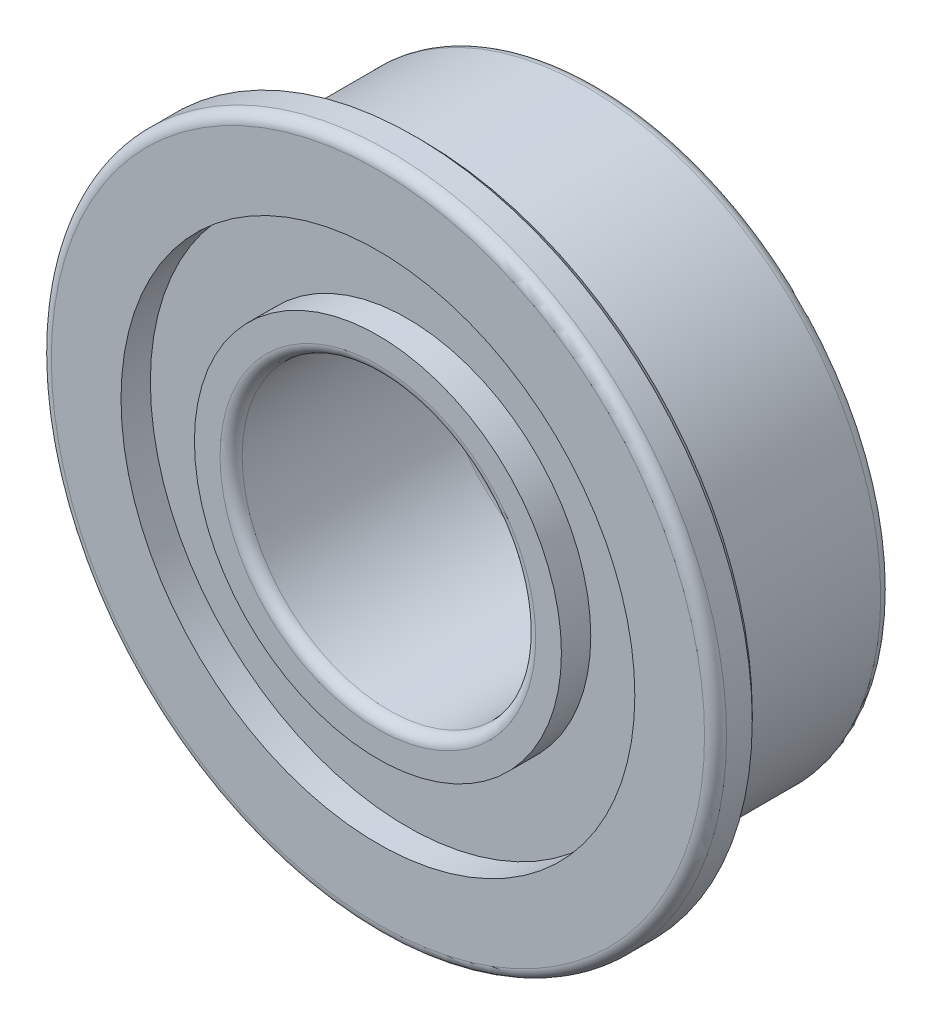
ISO-10303-21;
HEADER;
FILE_DESCRIPTION(('STEP AP214'),'2;1');
FILE_NAME('part.step','',(''),(''),'','','');
FILE_SCHEMA(('AUTOMOTIVE_DESIGN { 1 0 10303 214 1 1 1 1 }'));
ENDSEC;
DATA;
#1=APPLICATION_CONTEXT('core data for automotive mechanical design processes');
#2=APPLICATION_PROTOCOL_DEFINITION('international standard','automotive_design',2000,#1);
#3=PRODUCT_CONTEXT('',#1,'mechanical');
#4=PRODUCT('Part','Part','',(#3));
#5=PRODUCT_RELATED_PRODUCT_CATEGORY('part','',(#4));
#6=PRODUCT_DEFINITION_FORMATION('','',#4);
#7=PRODUCT_DEFINITION_CONTEXT('part definition',#1,'design');
#8=PRODUCT_DEFINITION('design','',#6,#7);
#9=PRODUCT_DEFINITION_SHAPE('','',#8);
#10=(LENGTH_UNIT() NAMED_UNIT(*) SI_UNIT(.MILLI.,.METRE.));
#11=(NAMED_UNIT(*) PLANE_ANGLE_UNIT() SI_UNIT($,.RADIAN.));
#12=(NAMED_UNIT(*) SI_UNIT($,.STERADIAN.) SOLID_ANGLE_UNIT());
#13=UNCERTAINTY_MEASURE_WITH_UNIT(LENGTH_MEASURE(1.E-05),#10,'distance_accuracy_value','');
#14=(GEOMETRIC_REPRESENTATION_CONTEXT(3) GLOBAL_UNCERTAINTY_ASSIGNED_CONTEXT((#13)) GLOBAL_UNIT_ASSIGNED_CONTEXT((#10,
#11,#12)) REPRESENTATION_CONTEXT('',''));
#15=CARTESIAN_POINT('',(0.,0.,0.));
#16=DIRECTION('',(0.,0.,1.));
#17=DIRECTION('',(1.,0.,0.));
#18=AXIS2_PLACEMENT_3D('',#15,#16,#17);
#19=CARTESIAN_POINT('',(0.,0.,2.85));
#20=DIRECTION('',(0.,0.,1.));
#21=DIRECTION('',(1.,0.,0.));
#22=AXIS2_PLACEMENT_3D('',#19,#20,#21);
#23=TOROIDAL_SURFACE('',#22,2.15,0.15);
#24=CARTESIAN_POINT('',(-2.15,0.,3.));
#25=CARTESIAN_POINT('',(-2.14979765177593,0.410125898039826,3.));
#26=CARTESIAN_POINT('',(-1.99904484728423,0.791403625558022,3.));
#27=CARTESIAN_POINT('',(-1.83568089713617,1.20457693852465,3.));
#28=CARTESIAN_POINT('',(-1.52027957955108,1.52027957955107,3.));
#29=CARTESIAN_POINT('',(-1.20631967116049,1.83453943431082,3.));
#30=CARTESIAN_POINT('',(-0.791403625558034,1.99904484728422,3.));
#31=CARTESIAN_POINT('',(-0.411157912228449,2.14980420876378,3.));
#32=CARTESIAN_POINT('',(0.,2.15,3.));
#33=CARTESIAN_POINT('',(0.409121407156996,2.15019482146321,3.));
#34=CARTESIAN_POINT('',(0.791403625558023,1.99904484728423,3.));
#35=CARTESIAN_POINT('',(1.2045769485649,1.83568088710541,3.));
#36=CARTESIAN_POINT('',(1.52027957955108,1.52027957955108,3.));
#37=CARTESIAN_POINT('',(1.83453929710262,1.20631980823783,3.));
#38=CARTESIAN_POINT('',(1.99904484728423,0.791403625558026,3.));
#39=CARTESIAN_POINT('',(2.14979713370125,0.411175948489697,3.));
#40=CARTESIAN_POINT('',(2.15,0.,3.));
#41=B_SPLINE_CURVE_WITH_KNOTS('',2,(#24,#25,#26,#27,#28,#29,#30,#31,#32,#33,#34,#35,#36,#37,#38,
#39,#40),.UNSPECIFIED.,.F.,.F.,(3,2,2,2,2,2,2,2,3),(0.,0.125,0.25,0.375,0.5,0.625,0.75,0.875,
1.),.UNSPECIFIED.);
#42=CARTESIAN_POINT('',(-2.15,0.,3.));
#43=VERTEX_POINT('',#42);
#44=CARTESIAN_POINT('',(2.15,0.,3.));
#45=VERTEX_POINT('',#44);
#46=EDGE_CURVE('E32',#43,#45,#41,.T.);
#47=ORIENTED_EDGE('',*,*,#46,.F.);
#48=CARTESIAN_POINT('',(2.15,0.,3.));
#49=CARTESIAN_POINT('',(2.14979765177593,-0.410125898040651,3.));
#50=CARTESIAN_POINT('',(1.99904484728422,-0.791403625558032,3.));
#51=CARTESIAN_POINT('',(1.83568089713584,-1.20457693852461,3.));
#52=CARTESIAN_POINT('',(1.52027957955108,-1.52027957955108,3.));
#53=CARTESIAN_POINT('',(1.20631967116154,-1.83453943431015,3.));
#54=CARTESIAN_POINT('',(0.791403625558024,-1.99904484728423,3.));
#55=CARTESIAN_POINT('',(0.411157912228607,-2.14980420876395,3.));
#56=CARTESIAN_POINT('',(0.,-2.15,3.));
#57=CARTESIAN_POINT('',(-0.409121407158147,-2.15019482146304,3.));
#58=CARTESIAN_POINT('',(-0.791403625558026,-1.99904484728423,3.));
#59=CARTESIAN_POINT('',(-1.20457694856478,-1.83568088710515,3.));
#60=CARTESIAN_POINT('',(-1.52027957955108,-1.52027957955108,3.));
#61=CARTESIAN_POINT('',(-1.83453929710133,-1.2063198082395,3.));
#62=CARTESIAN_POINT('',(-1.99904484728423,-0.791403625558031,3.));
#63=CARTESIAN_POINT('',(-2.14979713370124,-0.41117594849115,3.));
#64=CARTESIAN_POINT('',(-2.15,0.,3.));
#65=B_SPLINE_CURVE_WITH_KNOTS('',2,(#48,#49,#50,#51,#52,#53,#54,#55,#56,#57,#58,#59,#60,#61,#62,
#63,#64),.UNSPECIFIED.,.F.,.F.,(3,2,2,2,2,2,2,2,3),(0.,0.125,0.25,0.375,0.5,0.625,0.75,0.875,
1.),.UNSPECIFIED.);
#66=EDGE_CURVE('E34',#45,#43,#65,.T.);
#67=ORIENTED_EDGE('',*,*,#66,.F.);
#68=EDGE_LOOP('',(#47,#67));
#69=FACE_BOUND('',#68,.T.);
#70=CARTESIAN_POINT('',(0.,0.,2.85));
#71=DIRECTION('',(0.,0.,-1.));
#72=DIRECTION('',(-1.,0.,0.));
#73=AXIS2_PLACEMENT_3D('',#70,#71,#72);
#74=CIRCLE('',#73,2.);
#75=CARTESIAN_POINT('',(-2.,0.,2.85));
#76=VERTEX_POINT('',#75);
#77=EDGE_CURVE('E40',#76,#76,#74,.T.);
#78=ORIENTED_EDGE('',*,*,#77,.T.);
#79=EDGE_LOOP('',(#78));
#80=FACE_BOUND('',#79,.T.);
#81=ADVANCED_FACE('F16',(#69,#80),#23,.T.);
#82=CARTESIAN_POINT('',(0.,0.,3.));
#83=DIRECTION('',(0.,0.,1.));
#84=DIRECTION('',(1.,0.,0.));
#85=AXIS2_PLACEMENT_3D('',#82,#83,#84);
#86=PLANE('',#85);
#87=ORIENTED_EDGE('',*,*,#66,.T.);
#88=ORIENTED_EDGE('',*,*,#46,.T.);
#89=EDGE_LOOP('',(#87,#88));
#90=FACE_BOUND('',#89,.T.);
#91=CARTESIAN_POINT('',(0.,0.,3.));
#92=DIRECTION('',(0.,0.,1.));
#93=DIRECTION('',(1.,0.,0.));
#94=AXIS2_PLACEMENT_3D('',#91,#92,#93);
#95=CIRCLE('',#94,2.5);
#96=CARTESIAN_POINT('',(2.5,0.,3.));
#97=VERTEX_POINT('',#96);
#98=EDGE_CURVE('E20',#97,#97,#95,.F.);
#99=ORIENTED_EDGE('',*,*,#98,.F.);
#100=EDGE_LOOP('',(#99));
#101=FACE_BOUND('',#100,.T.);
#102=ADVANCED_FACE('F38',(#90,#101),#86,.T.);
#103=CARTESIAN_POINT('',(0.,0.,3.));
#104=DIRECTION('',(0.,0.,-1.));
#105=DIRECTION('',(-1.,0.,0.));
#106=AXIS2_PLACEMENT_3D('',#103,#104,#105);
#107=CYLINDRICAL_SURFACE('',#106,2.);
#108=CARTESIAN_POINT('',(0.,0.,0.15));
#109=DIRECTION('',(0.,0.,1.));
#110=DIRECTION('',(1.,0.,0.));
#111=AXIS2_PLACEMENT_3D('',#108,#109,#110);
#112=CIRCLE('',#111,2.);
#113=CARTESIAN_POINT('',(2.,0.,0.15));
#114=VERTEX_POINT('',#113);
#115=EDGE_CURVE('E145',#114,#114,#112,.T.);
#116=ORIENTED_EDGE('',*,*,#115,.F.);
#117=EDGE_LOOP('',(#116));
#118=FACE_BOUND('',#117,.T.);
#119=ORIENTED_EDGE('',*,*,#77,.F.);
#120=EDGE_LOOP('',(#119));
#121=FACE_BOUND('',#120,.T.);
#122=ADVANCED_FACE('F58',(#118,#121),#107,.F.);
#123=CARTESIAN_POINT('',(0.,0.,2.6));
#124=DIRECTION('',(0.,0.,1.));
#125=DIRECTION('',(1.,0.,0.));
#126=AXIS2_PLACEMENT_3D('',#123,#124,#125);
#127=CYLINDRICAL_SURFACE('',#126,2.5);
#128=ORIENTED_EDGE('',*,*,#98,.T.);
#129=EDGE_LOOP('',(#128));
#130=FACE_BOUND('',#129,.T.);
#131=CARTESIAN_POINT('',(0.,0.,2.6));
#132=DIRECTION('',(0.,0.,1.));
#133=DIRECTION('',(1.,0.,0.));
#134=AXIS2_PLACEMENT_3D('',#131,#132,#133);
#135=CIRCLE('',#134,2.5);
#136=CARTESIAN_POINT('',(2.5,0.,2.6));
#137=VERTEX_POINT('',#136);
#138=EDGE_CURVE('E143',#137,#137,#135,.F.);
#139=ORIENTED_EDGE('',*,*,#138,.F.);
#140=EDGE_LOOP('',(#139));
#141=FACE_BOUND('',#140,.T.);
#142=ADVANCED_FACE('F67',(#130,#141),#127,.T.);
#143=CARTESIAN_POINT('',(0.,0.,0.15));
#144=DIRECTION('',(0.,0.,1.));
#145=DIRECTION('',(1.,0.,0.));
#146=AXIS2_PLACEMENT_3D('',#143,#144,#145);
#147=TOROIDAL_SURFACE('',#146,2.15,0.15);
#148=ORIENTED_EDGE('',*,*,#115,.T.);
#149=EDGE_LOOP('',(#148));
#150=FACE_BOUND('',#149,.T.);
#151=CARTESIAN_POINT('',(0.,0.,0.));
#152=DIRECTION('',(0.,0.,1.));
#153=DIRECTION('',(1.,0.,0.));
#154=AXIS2_PLACEMENT_3D('',#151,#152,#153);
#155=CIRCLE('',#154,2.15);
#156=CARTESIAN_POINT('',(2.15,0.,0.));
#157=VERTEX_POINT('',#156);
#158=EDGE_CURVE('E144',#157,#157,#155,.F.);
#159=ORIENTED_EDGE('',*,*,#158,.T.);
#160=EDGE_LOOP('',(#159));
#161=FACE_BOUND('',#160,.T.);
#162=ADVANCED_FACE('F63',(#150,#161),#147,.T.);
#163=CARTESIAN_POINT('',(0.,0.,2.6));
#164=DIRECTION('',(0.,0.,1.));
#165=DIRECTION('',(1.,0.,0.));
#166=AXIS2_PLACEMENT_3D('',#163,#164,#165);
#167=PLANE('',#166);
#168=ORIENTED_EDGE('',*,*,#138,.T.);
#169=EDGE_LOOP('',(#168));
#170=FACE_BOUND('',#169,.T.);
#171=CARTESIAN_POINT('',(0.,0.,2.6));
#172=DIRECTION('',(0.,0.,1.));
#173=DIRECTION('',(1.,0.,0.));
#174=AXIS2_PLACEMENT_3D('',#171,#172,#173);
#175=CIRCLE('',#174,3.5);
#176=CARTESIAN_POINT('',(3.5,0.,2.6));
#177=VERTEX_POINT('',#176);
#178=EDGE_CURVE('E147',#177,#177,#175,.T.);
#179=ORIENTED_EDGE('',*,*,#178,.T.);
#180=EDGE_LOOP('',(#179));
#181=FACE_BOUND('',#180,.T.);
#182=ADVANCED_FACE('F66',(#170,#181),#167,.T.);
#183=CARTESIAN_POINT('',(0.,0.,0.));
#184=DIRECTION('',(0.,0.,1.));
#185=DIRECTION('',(1.,0.,0.));
#186=AXIS2_PLACEMENT_3D('',#183,#184,#185);
#187=PLANE('',#186);
#188=CARTESIAN_POINT('',(0.,0.,0.));
#189=DIRECTION('',(0.,0.,1.));
#190=DIRECTION('',(1.,0.,0.));
#191=AXIS2_PLACEMENT_3D('',#188,#189,#190);
#192=CIRCLE('',#191,2.35);
#193=CARTESIAN_POINT('',(2.35,0.,0.));
#194=VERTEX_POINT('',#193);
#195=EDGE_CURVE('E153',#194,#194,#192,.T.);
#196=ORIENTED_EDGE('',*,*,#195,.F.);
#197=EDGE_LOOP('',(#196));
#198=FACE_BOUND('',#197,.T.);
#199=ORIENTED_EDGE('',*,*,#158,.F.);
#200=EDGE_LOOP('',(#199));
#201=FACE_BOUND('',#200,.T.);
#202=ADVANCED_FACE('F125',(#198,#201),#187,.F.);
#203=CARTESIAN_POINT('',(0.,0.,2.6));
#204=DIRECTION('',(0.,0.,1.));
#205=DIRECTION('',(1.,0.,0.));
#206=AXIS2_PLACEMENT_3D('',#203,#204,#205);
#207=CYLINDRICAL_SURFACE('',#206,3.5);
#208=ORIENTED_EDGE('',*,*,#178,.F.);
#209=EDGE_LOOP('',(#208));
#210=FACE_BOUND('',#209,.T.);
#211=CARTESIAN_POINT('',(0.,0.,3.));
#212=DIRECTION('',(0.,0.,1.));
#213=DIRECTION('',(1.,0.,0.));
#214=AXIS2_PLACEMENT_3D('',#211,#212,#213);
#215=CIRCLE('',#214,3.5);
#216=CARTESIAN_POINT('',(3.5,0.,3.));
#217=VERTEX_POINT('',#216);
#218=EDGE_CURVE('E156',#217,#217,#215,.F.);
#219=ORIENTED_EDGE('',*,*,#218,.F.);
#220=EDGE_LOOP('',(#219));
#221=FACE_BOUND('',#220,.T.);
#222=ADVANCED_FACE('F72',(#210,#221),#207,.F.);
#223=CARTESIAN_POINT('',(0.,0.,0.15));
#224=DIRECTION('',(0.,0.,1.));
#225=DIRECTION('',(1.,0.,0.));
#226=AXIS2_PLACEMENT_3D('',#223,#224,#225);
#227=TOROIDAL_SURFACE('',#226,2.35,0.15);
#228=CARTESIAN_POINT('',(0.,0.,0.15));
#229=DIRECTION('',(0.,0.,-1.));
#230=DIRECTION('',(-1.,0.,0.));
#231=AXIS2_PLACEMENT_3D('',#228,#229,#230);
#232=CIRCLE('',#231,2.5);
#233=CARTESIAN_POINT('',(-2.5,0.,0.15));
#234=VERTEX_POINT('',#233);
#235=EDGE_CURVE('E159',#234,#234,#232,.F.);
#236=ORIENTED_EDGE('',*,*,#235,.F.);
#237=EDGE_LOOP('',(#236));
#238=FACE_BOUND('',#237,.T.);
#239=ORIENTED_EDGE('',*,*,#195,.T.);
#240=EDGE_LOOP('',(#239));
#241=FACE_BOUND('',#240,.T.);
#242=ADVANCED_FACE('F69',(#238,#241),#227,.T.);
#243=CARTESIAN_POINT('',(0.,0.,3.));
#244=DIRECTION('',(0.,0.,1.));
#245=DIRECTION('',(1.,0.,0.));
#246=AXIS2_PLACEMENT_3D('',#243,#244,#245);
#247=PLANE('',#246);
#248=CARTESIAN_POINT('',(0.,0.,3.));
#249=DIRECTION('',(0.,0.,1.));
#250=DIRECTION('',(0.,-1.,0.));
#251=AXIS2_PLACEMENT_3D('',#248,#249,#250);
#252=CIRCLE('',#251,4.45);
#253=CARTESIAN_POINT('',(0.,-4.45,3.));
#254=VERTEX_POINT('',#253);
#255=EDGE_CURVE('E160',#254,#254,#252,.F.);
#256=ORIENTED_EDGE('',*,*,#255,.F.);
#257=EDGE_LOOP('',(#256));
#258=FACE_BOUND('',#257,.T.);
#259=ORIENTED_EDGE('',*,*,#218,.T.);
#260=EDGE_LOOP('',(#259));
#261=FACE_BOUND('',#260,.T.);
#262=ADVANCED_FACE('F71',(#258,#261),#247,.T.);
#263=CARTESIAN_POINT('',(0.,0.,0.2));
#264=DIRECTION('',(0.,0.,-1.));
#265=DIRECTION('',(-1.,0.,0.));
#266=AXIS2_PLACEMENT_3D('',#263,#264,#265);
#267=CYLINDRICAL_SURFACE('',#266,2.5);
#268=ORIENTED_EDGE('',*,*,#235,.T.);
#269=EDGE_LOOP('',(#268));
#270=FACE_BOUND('',#269,.T.);
#271=CARTESIAN_POINT('',(0.,0.,0.2));
#272=DIRECTION('',(0.,0.,-1.));
#273=DIRECTION('',(-1.,0.,0.));
#274=AXIS2_PLACEMENT_3D('',#271,#272,#273);
#275=CIRCLE('',#274,2.5);
#276=CARTESIAN_POINT('',(-2.5,0.,0.2));
#277=VERTEX_POINT('',#276);
#278=EDGE_CURVE('E162',#277,#277,#275,.F.);
#279=ORIENTED_EDGE('',*,*,#278,.F.);
#280=EDGE_LOOP('',(#279));
#281=FACE_BOUND('',#280,.T.);
#282=ADVANCED_FACE('F77',(#270,#281),#267,.T.);
#283=CARTESIAN_POINT('',(0.,0.,2.85));
#284=DIRECTION('',(0.,0.,1.));
#285=DIRECTION('',(0.,-1.,0.));
#286=AXIS2_PLACEMENT_3D('',#283,#284,#285);
#287=TOROIDAL_SURFACE('',#286,4.45,0.149999999999999);
#288=ORIENTED_EDGE('',*,*,#255,.T.);
#289=EDGE_LOOP('',(#288));
#290=FACE_BOUND('',#289,.T.);
#291=CARTESIAN_POINT('',(0.,0.,2.85));
#292=DIRECTION('',(0.,0.,1.));
#293=DIRECTION('',(1.,0.,0.));
#294=AXIS2_PLACEMENT_3D('',#291,#292,#293);
#295=CIRCLE('',#294,4.6);
#296=CARTESIAN_POINT('',(4.6,0.,2.85));
#297=VERTEX_POINT('',#296);
#298=EDGE_CURVE('E165',#297,#297,#295,.F.);
#299=ORIENTED_EDGE('',*,*,#298,.F.);
#300=EDGE_LOOP('',(#299));
#301=FACE_BOUND('',#300,.T.);
#302=ADVANCED_FACE('F74',(#290,#301),#287,.T.);
#303=CARTESIAN_POINT('',(0.,0.,0.2));
#304=DIRECTION('',(0.,0.,-1.));
#305=DIRECTION('',(-1.,0.,0.));
#306=AXIS2_PLACEMENT_3D('',#303,#304,#305);
#307=PLANE('',#306);
#308=ORIENTED_EDGE('',*,*,#278,.T.);
#309=EDGE_LOOP('',(#308));
#310=FACE_BOUND('',#309,.T.);
#311=CARTESIAN_POINT('',(0.,0.,0.2));
#312=DIRECTION('',(0.,0.,-1.));
#313=DIRECTION('',(-1.,0.,0.));
#314=AXIS2_PLACEMENT_3D('',#311,#312,#313);
#315=CIRCLE('',#314,3.5);
#316=CARTESIAN_POINT('',(-3.5,0.,0.2));
#317=VERTEX_POINT('',#316);
#318=EDGE_CURVE('E166',#317,#317,#315,.T.);
#319=ORIENTED_EDGE('',*,*,#318,.T.);
#320=EDGE_LOOP('',(#319));
#321=FACE_BOUND('',#320,.T.);
#322=ADVANCED_FACE('F76',(#310,#321),#307,.T.);
#323=CARTESIAN_POINT('',(0.,0.,2.4));
#324=DIRECTION('',(0.,0.,1.));
#325=DIRECTION('',(1.,0.,0.));
#326=AXIS2_PLACEMENT_3D('',#323,#324,#325);
#327=CYLINDRICAL_SURFACE('',#326,4.6);
#328=ORIENTED_EDGE('',*,*,#298,.T.);
#329=EDGE_LOOP('',(#328));
#330=FACE_BOUND('',#329,.T.);
#331=CARTESIAN_POINT('',(0.,0.,2.49999999994088));
#332=DIRECTION('',(0.,0.,1.));
#333=DIRECTION('',(1.,0.,0.));
#334=AXIS2_PLACEMENT_3D('',#331,#332,#333);
#335=CIRCLE('',#334,4.59999999992533);
#336=CARTESIAN_POINT('',(4.59999999992533,0.,2.49999999994088));
#337=VERTEX_POINT('',#336);
#338=EDGE_CURVE('E169',#337,#337,#335,.F.);
#339=ORIENTED_EDGE('',*,*,#338,.F.);
#340=EDGE_LOOP('',(#339));
#341=FACE_BOUND('',#340,.T.);
#342=ADVANCED_FACE('F84',(#330,#341),#327,.T.);
#343=CARTESIAN_POINT('',(0.,0.,0.2));
#344=DIRECTION('',(0.,0.,-1.));
#345=DIRECTION('',(-1.,0.,0.));
#346=AXIS2_PLACEMENT_3D('',#343,#344,#345);
#347=CYLINDRICAL_SURFACE('',#346,3.5);
#348=ORIENTED_EDGE('',*,*,#318,.F.);
#349=EDGE_LOOP('',(#348));
#350=FACE_BOUND('',#349,.T.);
#351=CARTESIAN_POINT('',(0.,0.,0.));
#352=DIRECTION('',(0.,0.,-1.));
#353=DIRECTION('',(-1.,0.,0.));
#354=AXIS2_PLACEMENT_3D('',#351,#352,#353);
#355=CIRCLE('',#354,3.5);
#356=CARTESIAN_POINT('',(-3.5,0.,0.));
#357=VERTEX_POINT('',#356);
#358=EDGE_CURVE('E170',#357,#357,#355,.T.);
#359=ORIENTED_EDGE('',*,*,#358,.T.);
#360=EDGE_LOOP('',(#359));
#361=FACE_BOUND('',#360,.T.);
#362=ADVANCED_FACE('F112',(#350,#361),#347,.F.);
#363=CARTESIAN_POINT('',(0.,0.,2.49999999994088));
#364=DIRECTION('',(0.,0.,1.));
#365=DIRECTION('',(1.,0.,0.));
#366=AXIS2_PLACEMENT_3D('',#363,#364,#365);
#367=CONICAL_SURFACE('',#366,4.59999999992533,0.785398163397448);
#368=ORIENTED_EDGE('',*,*,#338,.T.);
#369=EDGE_LOOP('',(#368));
#370=FACE_BOUND('',#369,.T.);
#371=CARTESIAN_POINT('',(0.,0.,2.39999999990914));
#372=DIRECTION('',(0.,0.,1.));
#373=DIRECTION('',(1.,0.,0.));
#374=AXIS2_PLACEMENT_3D('',#371,#372,#373);
#375=CIRCLE('',#374,4.49999999989359);
#376=CARTESIAN_POINT('',(4.49999999989359,0.,2.39999999990914));
#377=VERTEX_POINT('',#376);
#378=EDGE_CURVE('E173',#377,#377,#375,.T.);
#379=ORIENTED_EDGE('',*,*,#378,.T.);
#380=EDGE_LOOP('',(#379));
#381=FACE_BOUND('',#380,.T.);
#382=ADVANCED_FACE('F108',(#370,#381),#367,.T.);
#383=CARTESIAN_POINT('',(0.,0.,0.));
#384=DIRECTION('',(0.,0.,1.));
#385=DIRECTION('',(1.,0.,0.));
#386=AXIS2_PLACEMENT_3D('',#383,#384,#385);
#387=PLANE('',#386);
#388=CARTESIAN_POINT('',(0.,0.,0.));
#389=DIRECTION('',(0.,0.,1.));
#390=DIRECTION('',(1.,0.,0.));
#391=AXIS2_PLACEMENT_3D('',#388,#389,#390);
#392=CIRCLE('',#391,3.85);
#393=CARTESIAN_POINT('',(3.85,0.,0.));
#394=VERTEX_POINT('',#393);
#395=EDGE_CURVE('E176',#394,#394,#392,.T.);
#396=ORIENTED_EDGE('',*,*,#395,.F.);
#397=EDGE_LOOP('',(#396));
#398=FACE_BOUND('',#397,.T.);
#399=ORIENTED_EDGE('',*,*,#358,.F.);
#400=EDGE_LOOP('',(#399));
#401=FACE_BOUND('',#400,.T.);
#402=ADVANCED_FACE('F104',(#398,#401),#387,.F.);
#403=CARTESIAN_POINT('',(0.,0.,2.4));
#404=DIRECTION('',(0.,0.,1.));
#405=DIRECTION('',(1.,0.,0.));
#406=AXIS2_PLACEMENT_3D('',#403,#404,#405);
#407=PLANE('',#406);
#408=ORIENTED_EDGE('',*,*,#378,.F.);
#409=EDGE_LOOP('',(#408));
#410=FACE_BOUND('',#409,.T.);
#411=CARTESIAN_POINT('',(0.,0.,2.4));
#412=DIRECTION('',(0.,0.,-1.));
#413=DIRECTION('',(-1.,0.,0.));
#414=AXIS2_PLACEMENT_3D('',#411,#412,#413);
#415=CIRCLE('',#414,4.);
#416=CARTESIAN_POINT('',(-4.,0.,2.4));
#417=VERTEX_POINT('',#416);
#418=EDGE_CURVE('E25',#417,#417,#415,.T.);
#419=ORIENTED_EDGE('',*,*,#418,.F.);
#420=EDGE_LOOP('',(#419));
#421=FACE_BOUND('',#420,.T.);
#422=ADVANCED_FACE('F98',(#410,#421),#407,.F.);
#423=CARTESIAN_POINT('',(0.,0.,0.149999999999998));
#424=DIRECTION('',(0.,0.,1.));
#425=DIRECTION('',(1.,0.,0.));
#426=AXIS2_PLACEMENT_3D('',#423,#424,#425);
#427=TOROIDAL_SURFACE('',#426,3.85,0.149999999999999);
#428=CARTESIAN_POINT('',(0.,0.,0.15));
#429=DIRECTION('',(0.,0.,-1.));
#430=DIRECTION('',(-1.,0.,0.));
#431=AXIS2_PLACEMENT_3D('',#428,#429,#430);
#432=CIRCLE('',#431,4.);
#433=CARTESIAN_POINT('',(-4.,0.,0.15));
#434=VERTEX_POINT('',#433);
#435=EDGE_CURVE('E11',#434,#434,#432,.F.);
#436=ORIENTED_EDGE('',*,*,#435,.F.);
#437=EDGE_LOOP('',(#436));
#438=FACE_BOUND('',#437,.T.);
#439=ORIENTED_EDGE('',*,*,#395,.T.);
#440=EDGE_LOOP('',(#439));
#441=FACE_BOUND('',#440,.T.);
#442=ADVANCED_FACE('F18',(#438,#441),#427,.T.);
#443=CARTESIAN_POINT('',(0.,0.,3.));
#444=DIRECTION('',(0.,0.,-1.));
#445=DIRECTION('',(-1.,0.,0.));
#446=AXIS2_PLACEMENT_3D('',#443,#444,#445);
#447=CYLINDRICAL_SURFACE('',#446,4.);
#448=ORIENTED_EDGE('',*,*,#435,.T.);
#449=EDGE_LOOP('',(#448));
#450=FACE_BOUND('',#449,.T.);
#451=ORIENTED_EDGE('',*,*,#418,.T.);
#452=EDGE_LOOP('',(#451));
#453=FACE_BOUND('',#452,.T.);
#454=ADVANCED_FACE('F91',(#450,#453),#447,.T.);
#455=CLOSED_SHELL('',(#81,#102,#122,#142,#162,#182,#202,#222,#242,#262,#282,#302,#322,#342,#362,
#382,#402,#422,#442,#454));
#456=MANIFOLD_SOLID_BREP('B1',#455);
#457=ADVANCED_BREP_SHAPE_REPRESENTATION('',(#18,#456),#14);
#458=SHAPE_DEFINITION_REPRESENTATION(#9,#457);
ENDSEC;
END-ISO-10303-21;
